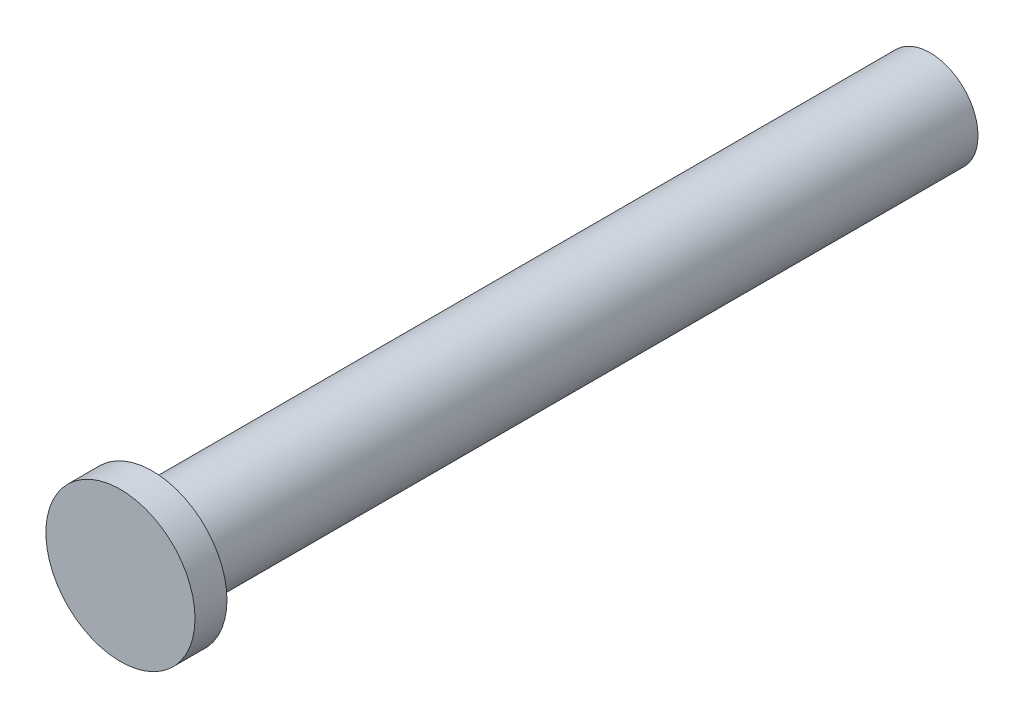
ISO-10303-21;
HEADER;
FILE_DESCRIPTION(('STEP AP214'),'2;1');
FILE_NAME('part.step','',(''),(''),'','','');
FILE_SCHEMA(('AUTOMOTIVE_DESIGN { 1 0 10303 214 1 1 1 1 }'));
ENDSEC;
DATA;
#1=APPLICATION_CONTEXT('core data for automotive mechanical design processes');
#2=APPLICATION_PROTOCOL_DEFINITION('international standard','automotive_design',2000,#1);
#3=PRODUCT_CONTEXT('',#1,'mechanical');
#4=PRODUCT('Part','Part','',(#3));
#5=PRODUCT_RELATED_PRODUCT_CATEGORY('part','',(#4));
#6=PRODUCT_DEFINITION_FORMATION('','',#4);
#7=PRODUCT_DEFINITION_CONTEXT('part definition',#1,'design');
#8=PRODUCT_DEFINITION('design','',#6,#7);
#9=PRODUCT_DEFINITION_SHAPE('','',#8);
#10=(LENGTH_UNIT() NAMED_UNIT(*) SI_UNIT(.MILLI.,.METRE.));
#11=(NAMED_UNIT(*) PLANE_ANGLE_UNIT() SI_UNIT($,.RADIAN.));
#12=(NAMED_UNIT(*) SI_UNIT($,.STERADIAN.) SOLID_ANGLE_UNIT());
#13=UNCERTAINTY_MEASURE_WITH_UNIT(LENGTH_MEASURE(1.E-05),#10,'distance_accuracy_value','');
#14=(GEOMETRIC_REPRESENTATION_CONTEXT(3) GLOBAL_UNCERTAINTY_ASSIGNED_CONTEXT((#13)) GLOBAL_UNIT_ASSIGNED_CONTEXT((#10,
#11,#12)) REPRESENTATION_CONTEXT('',''));
#15=CARTESIAN_POINT('',(0.,0.,0.));
#16=DIRECTION('',(0.,0.,1.));
#17=DIRECTION('',(1.,0.,0.));
#18=AXIS2_PLACEMENT_3D('',#15,#16,#17);
#19=CARTESIAN_POINT('',(0.,0.,219.133333333333));
#20=DIRECTION('',(0.,0.,-1.));
#21=DIRECTION('',(-1.,0.,0.));
#22=AXIS2_PLACEMENT_3D('',#19,#20,#21);
#23=PLANE('',#22);
#24=CARTESIAN_POINT('',(0.,0.,219.133333333333));
#25=DIRECTION('',(0.,0.,1.));
#26=DIRECTION('',(1.,0.,0.));
#27=AXIS2_PLACEMENT_3D('',#24,#25,#26);
#28=CIRCLE('',#27,35.);
#29=CARTESIAN_POINT('',(35.,0.,219.133333333333));
#30=VERTEX_POINT('',#29);
#31=EDGE_CURVE('E10',#30,#30,#28,.T.);
#32=ORIENTED_EDGE('',*,*,#31,.T.);
#33=EDGE_LOOP('',(#32));
#34=FACE_BOUND('',#33,.T.);
#35=ADVANCED_FACE('F40',(#34),#23,.F.);
#36=CARTESIAN_POINT('',(0.,0.,219.133333333333));
#37=DIRECTION('',(0.,0.,1.));
#38=DIRECTION('',(1.,0.,0.));
#39=AXIS2_PLACEMENT_3D('',#36,#37,#38);
#40=CYLINDRICAL_SURFACE('',#39,35.);
#41=ORIENTED_EDGE('',*,*,#31,.F.);
#42=EDGE_LOOP('',(#41));
#43=FACE_BOUND('',#42,.T.);
#44=CARTESIAN_POINT('',(0.,0.,204.133333333333));
#45=DIRECTION('',(0.,0.,1.));
#46=DIRECTION('',(1.,0.,0.));
#47=AXIS2_PLACEMENT_3D('',#44,#45,#46);
#48=CIRCLE('',#47,35.);
#49=CARTESIAN_POINT('',(35.,0.,204.133333333333));
#50=VERTEX_POINT('',#49);
#51=EDGE_CURVE('E43',#50,#50,#48,.T.);
#52=ORIENTED_EDGE('',*,*,#51,.T.);
#53=EDGE_LOOP('',(#52));
#54=FACE_BOUND('',#53,.T.);
#55=ADVANCED_FACE('F69',(#43,#54),#40,.T.);
#56=CARTESIAN_POINT('',(0.,35.,204.133333333333));
#57=DIRECTION('',(0.,0.,1.));
#58=DIRECTION('',(1.,0.,0.));
#59=AXIS2_PLACEMENT_3D('',#56,#57,#58);
#60=PLANE('',#59);
#61=ORIENTED_EDGE('',*,*,#51,.F.);
#62=EDGE_LOOP('',(#61));
#63=FACE_BOUND('',#62,.T.);
#64=CARTESIAN_POINT('',(0.,0.,204.133333333333));
#65=DIRECTION('',(0.,0.,1.));
#66=DIRECTION('',(1.,0.,0.));
#67=AXIS2_PLACEMENT_3D('',#64,#65,#66);
#68=CIRCLE('',#67,22.5);
#69=CARTESIAN_POINT('',(22.5,0.,204.133333333333));
#70=VERTEX_POINT('',#69);
#71=EDGE_CURVE('E50',#70,#70,#68,.T.);
#72=ORIENTED_EDGE('',*,*,#71,.T.);
#73=EDGE_LOOP('',(#72));
#74=FACE_BOUND('',#73,.T.);
#75=ADVANCED_FACE('F65',(#63,#74),#60,.F.);
#76=CARTESIAN_POINT('',(0.,0.,219.133333333333));
#77=DIRECTION('',(0.,0.,1.));
#78=DIRECTION('',(1.,0.,0.));
#79=AXIS2_PLACEMENT_3D('',#76,#77,#78);
#80=CYLINDRICAL_SURFACE('',#79,22.5);
#81=ORIENTED_EDGE('',*,*,#71,.F.);
#82=EDGE_LOOP('',(#81));
#83=FACE_BOUND('',#82,.T.);
#84=CARTESIAN_POINT('',(0.,0.,-160.866666666667));
#85=DIRECTION('',(0.,0.,1.));
#86=DIRECTION('',(1.,0.,0.));
#87=AXIS2_PLACEMENT_3D('',#84,#85,#86);
#88=CIRCLE('',#87,22.5);
#89=CARTESIAN_POINT('',(22.5,0.,-160.866666666667));
#90=VERTEX_POINT('',#89);
#91=EDGE_CURVE('E51',#90,#90,#88,.T.);
#92=ORIENTED_EDGE('',*,*,#91,.T.);
#93=EDGE_LOOP('',(#92));
#94=FACE_BOUND('',#93,.T.);
#95=ADVANCED_FACE('F60',(#83,#94),#80,.T.);
#96=CARTESIAN_POINT('',(0.,22.5,-160.866666666667));
#97=DIRECTION('',(0.,0.,1.));
#98=DIRECTION('',(1.,0.,0.));
#99=AXIS2_PLACEMENT_3D('',#96,#97,#98);
#100=PLANE('',#99);
#101=ORIENTED_EDGE('',*,*,#91,.F.);
#102=EDGE_LOOP('',(#101));
#103=FACE_BOUND('',#102,.T.);
#104=ADVANCED_FACE('F56',(#103),#100,.F.);
#105=CLOSED_SHELL('',(#35,#55,#75,#95,#104));
#106=MANIFOLD_SOLID_BREP('B2',#105);
#107=ADVANCED_BREP_SHAPE_REPRESENTATION('',(#18,#106),#14);
#108=SHAPE_DEFINITION_REPRESENTATION(#9,#107);
ENDSEC;
END-ISO-10303-21;
